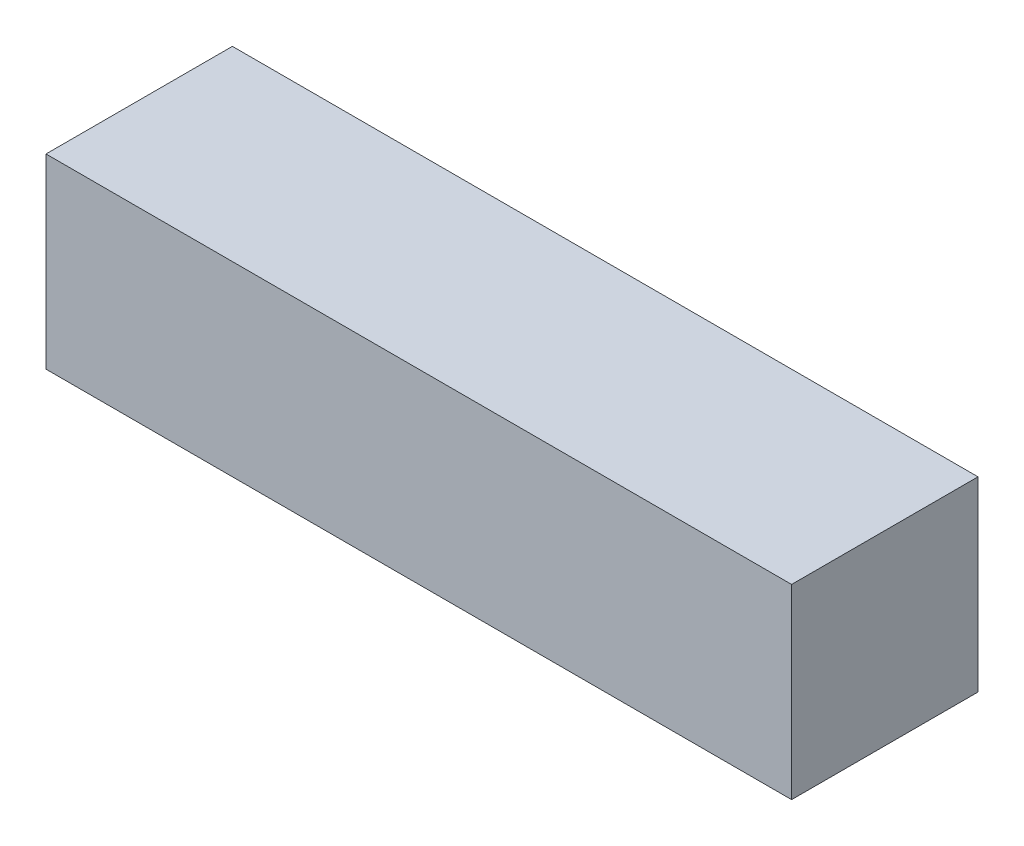
ISO-10303-21;
HEADER;
FILE_DESCRIPTION(('STEP AP214'),'2;1');
FILE_NAME('part.step','',(''),(''),'','','');
FILE_SCHEMA(('AUTOMOTIVE_DESIGN { 1 0 10303 214 1 1 1 1 }'));
ENDSEC;
DATA;
#1=APPLICATION_CONTEXT('core data for automotive mechanical design processes');
#2=APPLICATION_PROTOCOL_DEFINITION('international standard','automotive_design',2000,#1);
#3=PRODUCT_CONTEXT('',#1,'mechanical');
#4=PRODUCT('Part','Part','',(#3));
#5=PRODUCT_RELATED_PRODUCT_CATEGORY('part','',(#4));
#6=PRODUCT_DEFINITION_FORMATION('','',#4);
#7=PRODUCT_DEFINITION_CONTEXT('part definition',#1,'design');
#8=PRODUCT_DEFINITION('design','',#6,#7);
#9=PRODUCT_DEFINITION_SHAPE('','',#8);
#10=(LENGTH_UNIT() NAMED_UNIT(*) SI_UNIT(.MILLI.,.METRE.));
#11=(NAMED_UNIT(*) PLANE_ANGLE_UNIT() SI_UNIT($,.RADIAN.));
#12=(NAMED_UNIT(*) SI_UNIT($,.STERADIAN.) SOLID_ANGLE_UNIT());
#13=UNCERTAINTY_MEASURE_WITH_UNIT(LENGTH_MEASURE(1.E-05),#10,'distance_accuracy_value','');
#14=(GEOMETRIC_REPRESENTATION_CONTEXT(3) GLOBAL_UNCERTAINTY_ASSIGNED_CONTEXT((#13)) GLOBAL_UNIT_ASSIGNED_CONTEXT((#10,
#11,#12)) REPRESENTATION_CONTEXT('',''));
#15=CARTESIAN_POINT('',(0.,0.,0.));
#16=DIRECTION('',(0.,0.,1.));
#17=DIRECTION('',(1.,0.,0.));
#18=AXIS2_PLACEMENT_3D('',#15,#16,#17);
#19=CARTESIAN_POINT('',(19.05,4.7625,4.7625));
#20=DIRECTION('',(0.,0.,-1.));
#21=DIRECTION('',(-1.,0.,0.));
#22=AXIS2_PLACEMENT_3D('',#19,#20,#21);
#23=PLANE('',#22);
#24=DIRECTION('',(0.,-1.,0.));
#25=VECTOR('',#24,1.);
#26=CARTESIAN_POINT('',(-19.05,4.7625,4.7625));
#27=LINE('',#26,#25);
#28=CARTESIAN_POINT('',(-19.05,4.7625,4.7625));
#29=VERTEX_POINT('',#28);
#30=CARTESIAN_POINT('',(-19.05,-4.7625,4.7625));
#31=VERTEX_POINT('',#30);
#32=EDGE_CURVE('E107',#29,#31,#27,.T.);
#33=ORIENTED_EDGE('',*,*,#32,.T.);
#34=DIRECTION('',(-1.,0.,0.));
#35=VECTOR('',#34,1.);
#36=CARTESIAN_POINT('',(19.05,-4.7625,4.7625));
#37=LINE('',#36,#35);
#38=CARTESIAN_POINT('',(19.05,-4.7625,4.7625));
#39=VERTEX_POINT('',#38);
#40=EDGE_CURVE('E11',#39,#31,#37,.T.);
#41=ORIENTED_EDGE('',*,*,#40,.F.);
#42=DIRECTION('',(0.,-1.,0.));
#43=VECTOR('',#42,1.);
#44=CARTESIAN_POINT('',(19.05,4.7625,4.7625));
#45=LINE('',#44,#43);
#46=CARTESIAN_POINT('',(19.05,4.7625,4.7625));
#47=VERTEX_POINT('',#46);
#48=EDGE_CURVE('E91',#47,#39,#45,.T.);
#49=ORIENTED_EDGE('',*,*,#48,.F.);
#50=DIRECTION('',(-1.,0.,0.));
#51=VECTOR('',#50,1.);
#52=CARTESIAN_POINT('',(19.05,4.7625,4.7625));
#53=LINE('',#52,#51);
#54=EDGE_CURVE('E103',#47,#29,#53,.T.);
#55=ORIENTED_EDGE('',*,*,#54,.T.);
#56=EDGE_LOOP('',(#33,#41,#49,#55));
#57=FACE_BOUND('',#56,.T.);
#58=ADVANCED_FACE('F39',(#57),#23,.F.);
#59=CARTESIAN_POINT('',(19.05,-4.7625,4.7625));
#60=DIRECTION('',(0.,1.,0.));
#61=DIRECTION('',(0.,0.,1.));
#62=AXIS2_PLACEMENT_3D('',#59,#60,#61);
#63=PLANE('',#62);
#64=DIRECTION('',(0.,0.,-1.));
#65=VECTOR('',#64,1.);
#66=CARTESIAN_POINT('',(-19.05,-4.7625,4.7625));
#67=LINE('',#66,#65);
#68=CARTESIAN_POINT('',(-19.05,-4.7625,-4.7625));
#69=VERTEX_POINT('',#68);
#70=EDGE_CURVE('E96',#31,#69,#67,.T.);
#71=ORIENTED_EDGE('',*,*,#70,.T.);
#72=DIRECTION('',(-1.,0.,0.));
#73=VECTOR('',#72,1.);
#74=CARTESIAN_POINT('',(19.05,-4.7625,-4.7625));
#75=LINE('',#74,#73);
#76=CARTESIAN_POINT('',(19.05,-4.7625,-4.7625));
#77=VERTEX_POINT('',#76);
#78=EDGE_CURVE('E48',#77,#69,#75,.T.);
#79=ORIENTED_EDGE('',*,*,#78,.F.);
#80=DIRECTION('',(0.,0.,-1.));
#81=VECTOR('',#80,1.);
#82=CARTESIAN_POINT('',(19.05,-4.7625,4.7625));
#83=LINE('',#82,#81);
#84=EDGE_CURVE('E86',#39,#77,#83,.T.);
#85=ORIENTED_EDGE('',*,*,#84,.F.);
#86=ORIENTED_EDGE('',*,*,#40,.T.);
#87=EDGE_LOOP('',(#71,#79,#85,#86));
#88=FACE_BOUND('',#87,.T.);
#89=ADVANCED_FACE('F95',(#88),#63,.F.);
#90=CARTESIAN_POINT('',(19.05,4.7625,-4.7625));
#91=DIRECTION('',(0.,0.,1.));
#92=DIRECTION('',(1.,0.,0.));
#93=AXIS2_PLACEMENT_3D('',#90,#91,#92);
#94=PLANE('',#93);
#95=DIRECTION('',(0.,1.,0.));
#96=VECTOR('',#95,1.);
#97=CARTESIAN_POINT('',(-19.05,4.7625,-4.7625));
#98=LINE('',#97,#96);
#99=CARTESIAN_POINT('',(-19.05,4.7625,-4.7625));
#100=VERTEX_POINT('',#99);
#101=EDGE_CURVE('E73',#69,#100,#98,.T.);
#102=ORIENTED_EDGE('',*,*,#101,.T.);
#103=DIRECTION('',(-1.,0.,0.));
#104=VECTOR('',#103,1.);
#105=CARTESIAN_POINT('',(19.05,4.7625,-4.7625));
#106=LINE('',#105,#104);
#107=CARTESIAN_POINT('',(19.05,4.7625,-4.7625));
#108=VERTEX_POINT('',#107);
#109=EDGE_CURVE('E98',#108,#100,#106,.T.);
#110=ORIENTED_EDGE('',*,*,#109,.F.);
#111=DIRECTION('',(0.,1.,0.));
#112=VECTOR('',#111,1.);
#113=CARTESIAN_POINT('',(19.05,4.7625,-4.7625));
#114=LINE('',#113,#112);
#115=EDGE_CURVE('E89',#77,#108,#114,.T.);
#116=ORIENTED_EDGE('',*,*,#115,.F.);
#117=ORIENTED_EDGE('',*,*,#78,.T.);
#118=EDGE_LOOP('',(#102,#110,#116,#117));
#119=FACE_BOUND('',#118,.T.);
#120=ADVANCED_FACE('F99',(#119),#94,.F.);
#121=CARTESIAN_POINT('',(19.05,4.7625,4.7625));
#122=DIRECTION('',(0.,-1.,0.));
#123=DIRECTION('',(0.,0.,-1.));
#124=AXIS2_PLACEMENT_3D('',#121,#122,#123);
#125=PLANE('',#124);
#126=DIRECTION('',(0.,0.,1.));
#127=VECTOR('',#126,1.);
#128=CARTESIAN_POINT('',(-19.05,4.7625,4.7625));
#129=LINE('',#128,#127);
#130=EDGE_CURVE('E79',#100,#29,#129,.T.);
#131=ORIENTED_EDGE('',*,*,#130,.T.);
#132=ORIENTED_EDGE('',*,*,#54,.F.);
#133=DIRECTION('',(0.,0.,1.));
#134=VECTOR('',#133,1.);
#135=CARTESIAN_POINT('',(19.05,4.7625,4.7625));
#136=LINE('',#135,#134);
#137=EDGE_CURVE('E56',#108,#47,#136,.T.);
#138=ORIENTED_EDGE('',*,*,#137,.F.);
#139=ORIENTED_EDGE('',*,*,#109,.T.);
#140=EDGE_LOOP('',(#131,#132,#138,#139));
#141=FACE_BOUND('',#140,.T.);
#142=ADVANCED_FACE('F120',(#141),#125,.F.);
#143=CARTESIAN_POINT('',(19.05,0.,0.));
#144=DIRECTION('',(1.,0.,0.));
#145=DIRECTION('',(0.,0.,-1.));
#146=AXIS2_PLACEMENT_3D('',#143,#144,#145);
#147=PLANE('',#146);
#148=ORIENTED_EDGE('',*,*,#48,.T.);
#149=ORIENTED_EDGE('',*,*,#84,.T.);
#150=ORIENTED_EDGE('',*,*,#115,.T.);
#151=ORIENTED_EDGE('',*,*,#137,.T.);
#152=EDGE_LOOP('',(#148,#149,#150,#151));
#153=FACE_BOUND('',#152,.T.);
#154=ADVANCED_FACE('F87',(#153),#147,.T.);
#155=CARTESIAN_POINT('',(-19.05,0.,0.));
#156=DIRECTION('',(1.,0.,0.));
#157=DIRECTION('',(0.,0.,-1.));
#158=AXIS2_PLACEMENT_3D('',#155,#156,#157);
#159=PLANE('',#158);
#160=ORIENTED_EDGE('',*,*,#32,.F.);
#161=ORIENTED_EDGE('',*,*,#130,.F.);
#162=ORIENTED_EDGE('',*,*,#101,.F.);
#163=ORIENTED_EDGE('',*,*,#70,.F.);
#164=EDGE_LOOP('',(#160,#161,#162,#163));
#165=FACE_BOUND('',#164,.T.);
#166=ADVANCED_FACE('F123',(#165),#159,.F.);
#167=CLOSED_SHELL('',(#58,#89,#120,#142,#154,#166));
#168=MANIFOLD_SOLID_BREP('B2',#167);
#169=ADVANCED_BREP_SHAPE_REPRESENTATION('',(#18,#168),#14);
#170=SHAPE_DEFINITION_REPRESENTATION(#9,#169);
ENDSEC;
END-ISO-10303-21;
